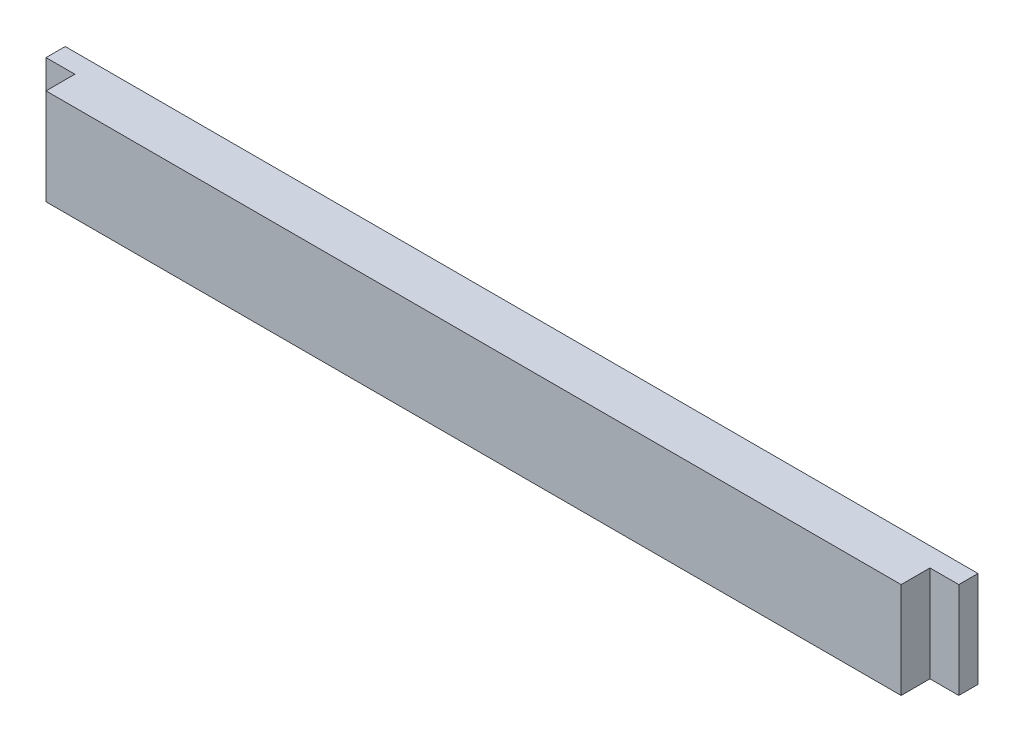
ISO-10303-21;
HEADER;
FILE_DESCRIPTION(('STEP AP214'),'2;1');
FILE_NAME('part.step','',(''),(''),'','','');
FILE_SCHEMA(('AUTOMOTIVE_DESIGN { 1 0 10303 214 1 1 1 1 }'));
ENDSEC;
DATA;
#1=APPLICATION_CONTEXT('core data for automotive mechanical design processes');
#2=APPLICATION_PROTOCOL_DEFINITION('international standard','automotive_design',2000,#1);
#3=PRODUCT_CONTEXT('',#1,'mechanical');
#4=PRODUCT('Part','Part','',(#3));
#5=PRODUCT_RELATED_PRODUCT_CATEGORY('part','',(#4));
#6=PRODUCT_DEFINITION_FORMATION('','',#4);
#7=PRODUCT_DEFINITION_CONTEXT('part definition',#1,'design');
#8=PRODUCT_DEFINITION('design','',#6,#7);
#9=PRODUCT_DEFINITION_SHAPE('','',#8);
#10=(LENGTH_UNIT() NAMED_UNIT(*) SI_UNIT(.MILLI.,.METRE.));
#11=(NAMED_UNIT(*) PLANE_ANGLE_UNIT() SI_UNIT($,.RADIAN.));
#12=(NAMED_UNIT(*) SI_UNIT($,.STERADIAN.) SOLID_ANGLE_UNIT());
#13=UNCERTAINTY_MEASURE_WITH_UNIT(LENGTH_MEASURE(1.E-05),#10,'distance_accuracy_value','');
#14=(GEOMETRIC_REPRESENTATION_CONTEXT(3) GLOBAL_UNCERTAINTY_ASSIGNED_CONTEXT((#13)) GLOBAL_UNIT_ASSIGNED_CONTEXT((#10,
#11,#12)) REPRESENTATION_CONTEXT('',''));
#15=CARTESIAN_POINT('',(0.,0.,0.));
#16=DIRECTION('',(0.,0.,1.));
#17=DIRECTION('',(1.,0.,0.));
#18=AXIS2_PLACEMENT_3D('',#15,#16,#17);
#19=CARTESIAN_POINT('',(95.,10.,10.));
#20=DIRECTION('',(-1.,0.,0.));
#21=DIRECTION('',(0.,0.,1.));
#22=AXIS2_PLACEMENT_3D('',#19,#20,#21);
#23=PLANE('',#22);
#24=DIRECTION('',(0.,1.,0.));
#25=VECTOR('',#24,1.);
#26=CARTESIAN_POINT('',(95.,10.,4.));
#27=LINE('',#26,#25);
#28=CARTESIAN_POINT('',(95.,-10.,4.));
#29=VERTEX_POINT('',#28);
#30=CARTESIAN_POINT('',(95.,10.,4.));
#31=VERTEX_POINT('',#30);
#32=EDGE_CURVE('E112',#29,#31,#27,.T.);
#33=ORIENTED_EDGE('',*,*,#32,.F.);
#34=DIRECTION('',(0.,0.,-1.));
#35=VECTOR('',#34,1.);
#36=CARTESIAN_POINT('',(95.,-10.,10.));
#37=LINE('',#36,#35);
#38=CARTESIAN_POINT('',(95.,-10.,0.));
#39=VERTEX_POINT('',#38);
#40=EDGE_CURVE('E44',#29,#39,#37,.T.);
#41=ORIENTED_EDGE('',*,*,#40,.T.);
#42=DIRECTION('',(0.,1.,0.));
#43=VECTOR('',#42,1.);
#44=CARTESIAN_POINT('',(95.,10.,0.));
#45=LINE('',#44,#43);
#46=CARTESIAN_POINT('',(95.,10.,0.));
#47=VERTEX_POINT('',#46);
#48=EDGE_CURVE('E153',#39,#47,#45,.T.);
#49=ORIENTED_EDGE('',*,*,#48,.T.);
#50=DIRECTION('',(0.,0.,-1.));
#51=VECTOR('',#50,1.);
#52=CARTESIAN_POINT('',(95.,10.,10.));
#53=LINE('',#52,#51);
#54=EDGE_CURVE('E159',#31,#47,#53,.T.);
#55=ORIENTED_EDGE('',*,*,#54,.F.);
#56=EDGE_LOOP('',(#33,#41,#49,#55));
#57=FACE_BOUND('',#56,.T.);
#58=ADVANCED_FACE('F35',(#57),#23,.F.);
#59=CARTESIAN_POINT('',(-95.,10.,10.));
#60=DIRECTION('',(1.,0.,0.));
#61=DIRECTION('',(0.,0.,-1.));
#62=AXIS2_PLACEMENT_3D('',#59,#60,#61);
#63=PLANE('',#62);
#64=DIRECTION('',(0.,-1.,0.));
#65=VECTOR('',#64,1.);
#66=CARTESIAN_POINT('',(-95.,10.,4.));
#67=LINE('',#66,#65);
#68=CARTESIAN_POINT('',(-95.,10.,4.));
#69=VERTEX_POINT('',#68);
#70=CARTESIAN_POINT('',(-95.,-10.,4.));
#71=VERTEX_POINT('',#70);
#72=EDGE_CURVE('E127',#69,#71,#67,.T.);
#73=ORIENTED_EDGE('',*,*,#72,.F.);
#74=DIRECTION('',(0.,0.,-1.));
#75=VECTOR('',#74,1.);
#76=CARTESIAN_POINT('',(-95.,10.,10.));
#77=LINE('',#76,#75);
#78=CARTESIAN_POINT('',(-95.,10.,0.));
#79=VERTEX_POINT('',#78);
#80=EDGE_CURVE('E147',#69,#79,#77,.T.);
#81=ORIENTED_EDGE('',*,*,#80,.T.);
#82=DIRECTION('',(0.,-1.,0.));
#83=VECTOR('',#82,1.);
#84=CARTESIAN_POINT('',(-95.,10.,0.));
#85=LINE('',#84,#83);
#86=CARTESIAN_POINT('',(-95.,-10.,0.));
#87=VERTEX_POINT('',#86);
#88=EDGE_CURVE('E140',#79,#87,#85,.T.);
#89=ORIENTED_EDGE('',*,*,#88,.T.);
#90=DIRECTION('',(0.,0.,-1.));
#91=VECTOR('',#90,1.);
#92=CARTESIAN_POINT('',(-95.,-10.,10.));
#93=LINE('',#92,#91);
#94=EDGE_CURVE('E11',#71,#87,#93,.T.);
#95=ORIENTED_EDGE('',*,*,#94,.F.);
#96=EDGE_LOOP('',(#73,#81,#89,#95));
#97=FACE_BOUND('',#96,.T.);
#98=ADVANCED_FACE('F37',(#97),#63,.F.);
#99=CARTESIAN_POINT('',(-95.,-10.,10.));
#100=DIRECTION('',(0.,1.,0.));
#101=DIRECTION('',(-1.,0.,0.));
#102=AXIS2_PLACEMENT_3D('',#99,#100,#101);
#103=PLANE('',#102);
#104=DIRECTION('',(1.,0.,0.));
#105=VECTOR('',#104,1.);
#106=CARTESIAN_POINT('',(95.,-10.,4.));
#107=LINE('',#106,#105);
#108=CARTESIAN_POINT('',(89.,-10.,4.));
#109=VERTEX_POINT('',#108);
#110=EDGE_CURVE('E106',#109,#29,#107,.T.);
#111=ORIENTED_EDGE('',*,*,#110,.F.);
#112=DIRECTION('',(0.,0.,1.));
#113=VECTOR('',#112,1.);
#114=CARTESIAN_POINT('',(89.,-10.,4.));
#115=LINE('',#114,#113);
#116=CARTESIAN_POINT('',(89.,-10.,10.));
#117=VERTEX_POINT('',#116);
#118=EDGE_CURVE('E103',#109,#117,#115,.T.);
#119=ORIENTED_EDGE('',*,*,#118,.T.);
#120=DIRECTION('',(1.,0.,0.));
#121=VECTOR('',#120,1.);
#122=CARTESIAN_POINT('',(-95.,-10.,10.));
#123=LINE('',#122,#121);
#124=CARTESIAN_POINT('',(-89.,-10.,10.));
#125=VERTEX_POINT('',#124);
#126=EDGE_CURVE('E142',#125,#117,#123,.T.);
#127=ORIENTED_EDGE('',*,*,#126,.F.);
#128=DIRECTION('',(0.,0.,1.));
#129=VECTOR('',#128,1.);
#130=CARTESIAN_POINT('',(-89.,-10.,4.));
#131=LINE('',#130,#129);
#132=CARTESIAN_POINT('',(-89.,-10.,4.));
#133=VERTEX_POINT('',#132);
#134=EDGE_CURVE('E59',#133,#125,#131,.T.);
#135=ORIENTED_EDGE('',*,*,#134,.F.);
#136=DIRECTION('',(1.,0.,0.));
#137=VECTOR('',#136,1.);
#138=CARTESIAN_POINT('',(-95.,-10.,4.));
#139=LINE('',#138,#137);
#140=EDGE_CURVE('E129',#71,#133,#139,.T.);
#141=ORIENTED_EDGE('',*,*,#140,.F.);
#142=ORIENTED_EDGE('',*,*,#94,.T.);
#143=DIRECTION('',(1.,0.,0.));
#144=VECTOR('',#143,1.);
#145=CARTESIAN_POINT('',(-95.,-10.,0.));
#146=LINE('',#145,#144);
#147=EDGE_CURVE('E150',#87,#39,#146,.T.);
#148=ORIENTED_EDGE('',*,*,#147,.T.);
#149=ORIENTED_EDGE('',*,*,#40,.F.);
#150=EDGE_LOOP('',(#111,#119,#127,#135,#141,#142,#148,#149));
#151=FACE_BOUND('',#150,.T.);
#152=ADVANCED_FACE('F167',(#151),#103,.F.);
#153=CARTESIAN_POINT('',(-95.,10.,10.));
#154=DIRECTION('',(0.,-1.,0.));
#155=DIRECTION('',(1.,0.,0.));
#156=AXIS2_PLACEMENT_3D('',#153,#154,#155);
#157=PLANE('',#156);
#158=DIRECTION('',(-1.,0.,0.));
#159=VECTOR('',#158,1.);
#160=CARTESIAN_POINT('',(-95.,10.,10.));
#161=LINE('',#160,#159);
#162=CARTESIAN_POINT('',(89.,10.,10.));
#163=VERTEX_POINT('',#162);
#164=CARTESIAN_POINT('',(-89.,10.,10.));
#165=VERTEX_POINT('',#164);
#166=EDGE_CURVE('E120',#163,#165,#161,.T.);
#167=ORIENTED_EDGE('',*,*,#166,.F.);
#168=DIRECTION('',(0.,0.,1.));
#169=VECTOR('',#168,1.);
#170=CARTESIAN_POINT('',(89.,10.,4.));
#171=LINE('',#170,#169);
#172=CARTESIAN_POINT('',(89.,10.,4.));
#173=VERTEX_POINT('',#172);
#174=EDGE_CURVE('E51',#173,#163,#171,.T.);
#175=ORIENTED_EDGE('',*,*,#174,.F.);
#176=DIRECTION('',(-1.,0.,0.));
#177=VECTOR('',#176,1.);
#178=CARTESIAN_POINT('',(95.,10.,4.));
#179=LINE('',#178,#177);
#180=EDGE_CURVE('E107',#31,#173,#179,.T.);
#181=ORIENTED_EDGE('',*,*,#180,.F.);
#182=ORIENTED_EDGE('',*,*,#54,.T.);
#183=DIRECTION('',(-1.,0.,0.));
#184=VECTOR('',#183,1.);
#185=CARTESIAN_POINT('',(-95.,10.,0.));
#186=LINE('',#185,#184);
#187=EDGE_CURVE('E145',#47,#79,#186,.T.);
#188=ORIENTED_EDGE('',*,*,#187,.T.);
#189=ORIENTED_EDGE('',*,*,#80,.F.);
#190=DIRECTION('',(-1.,0.,0.));
#191=VECTOR('',#190,1.);
#192=CARTESIAN_POINT('',(-95.,10.,4.));
#193=LINE('',#192,#191);
#194=CARTESIAN_POINT('',(-89.,10.,4.));
#195=VERTEX_POINT('',#194);
#196=EDGE_CURVE('E135',#195,#69,#193,.T.);
#197=ORIENTED_EDGE('',*,*,#196,.F.);
#198=DIRECTION('',(0.,0.,1.));
#199=VECTOR('',#198,1.);
#200=CARTESIAN_POINT('',(-89.,10.,4.));
#201=LINE('',#200,#199);
#202=EDGE_CURVE('E138',#195,#165,#201,.T.);
#203=ORIENTED_EDGE('',*,*,#202,.T.);
#204=EDGE_LOOP('',(#167,#175,#181,#182,#188,#189,#197,#203));
#205=FACE_BOUND('',#204,.T.);
#206=ADVANCED_FACE('F118',(#205),#157,.F.);
#207=CARTESIAN_POINT('',(0.,0.,10.));
#208=DIRECTION('',(0.,0.,1.));
#209=DIRECTION('',(1.,0.,0.));
#210=AXIS2_PLACEMENT_3D('',#207,#208,#209);
#211=PLANE('',#210);
#212=DIRECTION('',(0.,-1.,0.));
#213=VECTOR('',#212,1.);
#214=CARTESIAN_POINT('',(89.,10.,10.));
#215=LINE('',#214,#213);
#216=EDGE_CURVE('E115',#163,#117,#215,.T.);
#217=ORIENTED_EDGE('',*,*,#216,.F.);
#218=ORIENTED_EDGE('',*,*,#166,.T.);
#219=DIRECTION('',(0.,1.,0.));
#220=VECTOR('',#219,1.);
#221=CARTESIAN_POINT('',(-89.,10.,10.));
#222=LINE('',#221,#220);
#223=EDGE_CURVE('E122',#125,#165,#222,.T.);
#224=ORIENTED_EDGE('',*,*,#223,.F.);
#225=ORIENTED_EDGE('',*,*,#126,.T.);
#226=EDGE_LOOP('',(#217,#218,#224,#225));
#227=FACE_BOUND('',#226,.T.);
#228=ADVANCED_FACE('F181',(#227),#211,.T.);
#229=CARTESIAN_POINT('',(0.,0.,0.));
#230=DIRECTION('',(0.,0.,1.));
#231=DIRECTION('',(1.,0.,0.));
#232=AXIS2_PLACEMENT_3D('',#229,#230,#231);
#233=PLANE('',#232);
#234=CARTESIAN_POINT('',(-92.,0.,0.));
#235=DIRECTION('',(0.,0.,-1.));
#236=DIRECTION('',(-1.,0.,0.));
#237=AXIS2_PLACEMENT_3D('',#234,#235,#236);
#238=CIRCLE('',#237,1.5);
#239=CARTESIAN_POINT('',(-93.5,0.,0.));
#240=VERTEX_POINT('',#239);
#241=EDGE_CURVE('E278',#240,#240,#238,.T.);
#242=ORIENTED_EDGE('',*,*,#241,.F.);
#243=EDGE_LOOP('',(#242));
#244=FACE_BOUND('',#243,.T.);
#245=ORIENTED_EDGE('',*,*,#88,.F.);
#246=ORIENTED_EDGE('',*,*,#187,.F.);
#247=ORIENTED_EDGE('',*,*,#48,.F.);
#248=ORIENTED_EDGE('',*,*,#147,.F.);
#249=EDGE_LOOP('',(#245,#246,#247,#248));
#250=FACE_BOUND('',#249,.T.);
#251=ADVANCED_FACE('F172',(#244,#250),#233,.F.);
#252=CARTESIAN_POINT('',(-89.,10.,4.));
#253=DIRECTION('',(1.,0.,0.));
#254=DIRECTION('',(0.,0.,-1.));
#255=AXIS2_PLACEMENT_3D('',#252,#253,#254);
#256=PLANE('',#255);
#257=ORIENTED_EDGE('',*,*,#223,.T.);
#258=ORIENTED_EDGE('',*,*,#202,.F.);
#259=DIRECTION('',(0.,1.,0.));
#260=VECTOR('',#259,1.);
#261=CARTESIAN_POINT('',(-89.,10.,4.));
#262=LINE('',#261,#260);
#263=EDGE_CURVE('E132',#133,#195,#262,.T.);
#264=ORIENTED_EDGE('',*,*,#263,.F.);
#265=ORIENTED_EDGE('',*,*,#134,.T.);
#266=EDGE_LOOP('',(#257,#258,#264,#265));
#267=FACE_BOUND('',#266,.T.);
#268=ADVANCED_FACE('F182',(#267),#256,.F.);
#269=CARTESIAN_POINT('',(0.,0.,4.));
#270=DIRECTION('',(0.,0.,1.));
#271=DIRECTION('',(1.,0.,0.));
#272=AXIS2_PLACEMENT_3D('',#269,#270,#271);
#273=PLANE('',#272);
#274=CARTESIAN_POINT('',(-92.,0.,4.));
#275=DIRECTION('',(0.,0.,1.));
#276=DIRECTION('',(1.,0.,0.));
#277=AXIS2_PLACEMENT_3D('',#274,#275,#276);
#278=CIRCLE('',#277,1.5);
#279=CARTESIAN_POINT('',(-90.5,0.,4.));
#280=VERTEX_POINT('',#279);
#281=EDGE_CURVE('E39',#280,#280,#278,.T.);
#282=ORIENTED_EDGE('',*,*,#281,.F.);
#283=EDGE_LOOP('',(#282));
#284=FACE_BOUND('',#283,.T.);
#285=ORIENTED_EDGE('',*,*,#72,.T.);
#286=ORIENTED_EDGE('',*,*,#140,.T.);
#287=ORIENTED_EDGE('',*,*,#263,.T.);
#288=ORIENTED_EDGE('',*,*,#196,.T.);
#289=EDGE_LOOP('',(#285,#286,#287,#288));
#290=FACE_BOUND('',#289,.T.);
#291=ADVANCED_FACE('F178',(#284,#290),#273,.T.);
#292=CARTESIAN_POINT('',(89.,10.,4.));
#293=DIRECTION('',(-1.,0.,0.));
#294=DIRECTION('',(0.,0.,1.));
#295=AXIS2_PLACEMENT_3D('',#292,#293,#294);
#296=PLANE('',#295);
#297=ORIENTED_EDGE('',*,*,#216,.T.);
#298=ORIENTED_EDGE('',*,*,#118,.F.);
#299=DIRECTION('',(0.,-1.,0.));
#300=VECTOR('',#299,1.);
#301=CARTESIAN_POINT('',(89.,10.,4.));
#302=LINE('',#301,#300);
#303=EDGE_CURVE('E99',#173,#109,#302,.T.);
#304=ORIENTED_EDGE('',*,*,#303,.F.);
#305=ORIENTED_EDGE('',*,*,#174,.T.);
#306=EDGE_LOOP('',(#297,#298,#304,#305));
#307=FACE_BOUND('',#306,.T.);
#308=ADVANCED_FACE('F101',(#307),#296,.F.);
#309=CARTESIAN_POINT('',(0.,0.,4.));
#310=DIRECTION('',(0.,0.,1.));
#311=DIRECTION('',(1.,0.,0.));
#312=AXIS2_PLACEMENT_3D('',#309,#310,#311);
#313=PLANE('',#312);
#314=ORIENTED_EDGE('',*,*,#180,.T.);
#315=ORIENTED_EDGE('',*,*,#303,.T.);
#316=ORIENTED_EDGE('',*,*,#110,.T.);
#317=ORIENTED_EDGE('',*,*,#32,.T.);
#318=EDGE_LOOP('',(#314,#315,#316,#317));
#319=FACE_BOUND('',#318,.T.);
#320=ADVANCED_FACE('F110',(#319),#313,.T.);
#321=CARTESIAN_POINT('',(-92.,0.,6.));
#322=DIRECTION('',(0.,0.,-1.));
#323=DIRECTION('',(-1.,0.,0.));
#324=AXIS2_PLACEMENT_3D('',#321,#322,#323);
#325=CYLINDRICAL_SURFACE('',#324,1.5);
#326=ORIENTED_EDGE('',*,*,#281,.T.);
#327=EDGE_LOOP('',(#326));
#328=FACE_BOUND('',#327,.T.);
#329=ORIENTED_EDGE('',*,*,#241,.T.);
#330=EDGE_LOOP('',(#329));
#331=FACE_BOUND('',#330,.T.);
#332=ADVANCED_FACE('F229',(#328,#331),#325,.F.);
#333=CLOSED_SHELL('',(#58,#98,#152,#206,#228,#251,#268,#291,#308,#320,#332));
#334=MANIFOLD_SOLID_BREP('B2',#333);
#335=ADVANCED_BREP_SHAPE_REPRESENTATION('',(#18,#334),#14);
#336=SHAPE_DEFINITION_REPRESENTATION(#9,#335);
ENDSEC;
END-ISO-10303-21;
